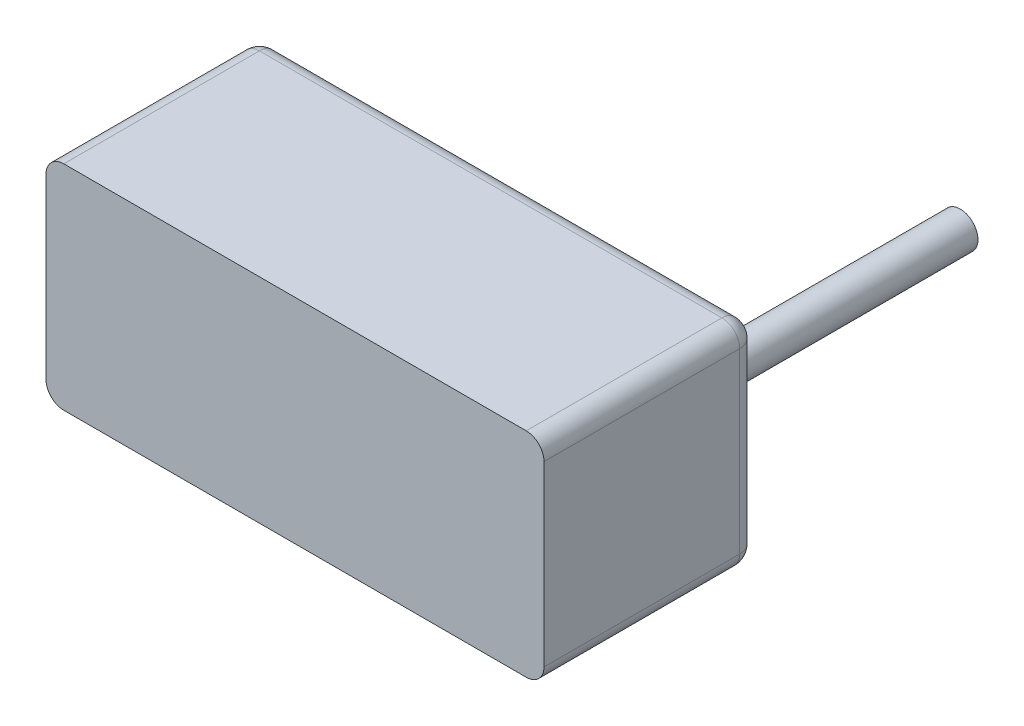
ISO-10303-21;
HEADER;
FILE_DESCRIPTION(('STEP AP214'),'2;1');
FILE_NAME('part.step','',(''),(''),'','','');
FILE_SCHEMA(('AUTOMOTIVE_DESIGN { 1 0 10303 214 1 1 1 1 }'));
ENDSEC;
DATA;
#1=APPLICATION_CONTEXT('core data for automotive mechanical design processes');
#2=APPLICATION_PROTOCOL_DEFINITION('international standard','automotive_design',2000,#1);
#3=PRODUCT_CONTEXT('',#1,'mechanical');
#4=PRODUCT('Part','Part','',(#3));
#5=PRODUCT_RELATED_PRODUCT_CATEGORY('part','',(#4));
#6=PRODUCT_DEFINITION_FORMATION('','',#4);
#7=PRODUCT_DEFINITION_CONTEXT('part definition',#1,'design');
#8=PRODUCT_DEFINITION('design','',#6,#7);
#9=PRODUCT_DEFINITION_SHAPE('','',#8);
#10=(LENGTH_UNIT() NAMED_UNIT(*) SI_UNIT(.MILLI.,.METRE.));
#11=(NAMED_UNIT(*) PLANE_ANGLE_UNIT() SI_UNIT($,.RADIAN.));
#12=(NAMED_UNIT(*) SI_UNIT($,.STERADIAN.) SOLID_ANGLE_UNIT());
#13=UNCERTAINTY_MEASURE_WITH_UNIT(LENGTH_MEASURE(1.E-05),#10,'distance_accuracy_value','');
#14=(GEOMETRIC_REPRESENTATION_CONTEXT(3) GLOBAL_UNCERTAINTY_ASSIGNED_CONTEXT((#13)) GLOBAL_UNIT_ASSIGNED_CONTEXT((#10,
#11,#12)) REPRESENTATION_CONTEXT('',''));
#15=CARTESIAN_POINT('',(0.,0.,0.));
#16=DIRECTION('',(0.,0.,1.));
#17=DIRECTION('',(1.,0.,0.));
#18=AXIS2_PLACEMENT_3D('',#15,#16,#17);
#19=CARTESIAN_POINT('',(-88.9,76.2,38.1));
#20=DIRECTION('',(1.,0.,0.));
#21=DIRECTION('',(0.,0.,-1.));
#22=AXIS2_PLACEMENT_3D('',#19,#20,#21);
#23=PLANE('',#22);
#24=DIRECTION('',(0.,0.,1.));
#25=VECTOR('',#24,1.);
#26=CARTESIAN_POINT('',(-88.9,69.85,-38.1));
#27=LINE('',#26,#25);
#28=CARTESIAN_POINT('',(-88.9,69.85,38.1));
#29=VERTEX_POINT('',#28);
#30=CARTESIAN_POINT('',(-88.9,69.85,-31.75));
#31=VERTEX_POINT('',#30);
#32=EDGE_CURVE('E132',#29,#31,#27,.F.);
#33=ORIENTED_EDGE('',*,*,#32,.T.);
#34=DIRECTION('',(0.,-1.,0.));
#35=VECTOR('',#34,1.);
#36=CARTESIAN_POINT('',(-88.9,76.2,-31.75));
#37=LINE('',#36,#35);
#38=CARTESIAN_POINT('',(-88.9,6.34999999999999,-31.75));
#39=VERTEX_POINT('',#38);
#40=EDGE_CURVE('E207',#31,#39,#37,.T.);
#41=ORIENTED_EDGE('',*,*,#40,.T.);
#42=DIRECTION('',(0.,0.,1.));
#43=VECTOR('',#42,1.);
#44=CARTESIAN_POINT('',(-88.9,6.34999999999999,38.1));
#45=LINE('',#44,#43);
#46=CARTESIAN_POINT('',(-88.9,6.35000000000002,38.1));
#47=VERTEX_POINT('',#46);
#48=EDGE_CURVE('E135',#39,#47,#45,.T.);
#49=ORIENTED_EDGE('',*,*,#48,.T.);
#50=DIRECTION('',(0.,-1.,0.));
#51=VECTOR('',#50,1.);
#52=CARTESIAN_POINT('',(-88.9,76.2,38.1));
#53=LINE('',#52,#51);
#54=EDGE_CURVE('E124',#29,#47,#53,.T.);
#55=ORIENTED_EDGE('',*,*,#54,.F.);
#56=EDGE_LOOP('',(#33,#41,#49,#55));
#57=FACE_BOUND('',#56,.T.);
#58=ADVANCED_FACE('F41',(#57),#23,.F.);
#59=CARTESIAN_POINT('',(88.9,76.2,38.1));
#60=DIRECTION('',(0.,0.,-1.));
#61=DIRECTION('',(-1.,0.,0.));
#62=AXIS2_PLACEMENT_3D('',#59,#60,#61);
#63=PLANE('',#62);
#64=ORIENTED_EDGE('',*,*,#54,.T.);
#65=CARTESIAN_POINT('',(-82.55,6.34999999999999,38.1));
#66=DIRECTION('',(0.,0.,-1.));
#67=DIRECTION('',(-1.,0.,0.));
#68=AXIS2_PLACEMENT_3D('',#65,#66,#67);
#69=CIRCLE('',#68,6.35);
#70=CARTESIAN_POINT('',(-82.55,0.,38.1));
#71=VERTEX_POINT('',#70);
#72=EDGE_CURVE('E151',#47,#71,#69,.F.);
#73=ORIENTED_EDGE('',*,*,#72,.T.);
#74=DIRECTION('',(1.,0.,0.));
#75=VECTOR('',#74,1.);
#76=CARTESIAN_POINT('',(88.9,0.,38.1));
#77=LINE('',#76,#75);
#78=CARTESIAN_POINT('',(82.55,0.,38.1));
#79=VERTEX_POINT('',#78);
#80=EDGE_CURVE('E248',#71,#79,#77,.T.);
#81=ORIENTED_EDGE('',*,*,#80,.T.);
#82=CARTESIAN_POINT('',(82.55,6.34999999999999,38.1));
#83=DIRECTION('',(0.,0.,-1.));
#84=DIRECTION('',(-1.,0.,0.));
#85=AXIS2_PLACEMENT_3D('',#82,#83,#84);
#86=CIRCLE('',#85,6.35);
#87=CARTESIAN_POINT('',(88.9,6.35000000000002,38.1));
#88=VERTEX_POINT('',#87);
#89=EDGE_CURVE('E128',#79,#88,#86,.F.);
#90=ORIENTED_EDGE('',*,*,#89,.T.);
#91=DIRECTION('',(0.,-1.,0.));
#92=VECTOR('',#91,1.);
#93=CARTESIAN_POINT('',(88.9,76.2,38.1));
#94=LINE('',#93,#92);
#95=CARTESIAN_POINT('',(88.9,69.85,38.1));
#96=VERTEX_POINT('',#95);
#97=EDGE_CURVE('E138',#96,#88,#94,.T.);
#98=ORIENTED_EDGE('',*,*,#97,.F.);
#99=CARTESIAN_POINT('',(82.55,69.85,38.1));
#100=DIRECTION('',(0.,0.,-1.));
#101=DIRECTION('',(-1.,0.,0.));
#102=AXIS2_PLACEMENT_3D('',#99,#100,#101);
#103=CIRCLE('',#102,6.35);
#104=CARTESIAN_POINT('',(82.55,76.2,38.1));
#105=VERTEX_POINT('',#104);
#106=EDGE_CURVE('E129',#96,#105,#103,.F.);
#107=ORIENTED_EDGE('',*,*,#106,.T.);
#108=DIRECTION('',(1.,0.,0.));
#109=VECTOR('',#108,1.);
#110=CARTESIAN_POINT('',(88.9,76.2,38.1));
#111=LINE('',#110,#109);
#112=CARTESIAN_POINT('',(-82.55,76.2,38.1));
#113=VERTEX_POINT('',#112);
#114=EDGE_CURVE('E126',#113,#105,#111,.T.);
#115=ORIENTED_EDGE('',*,*,#114,.F.);
#116=CARTESIAN_POINT('',(-82.55,69.85,38.1));
#117=DIRECTION('',(0.,0.,-1.));
#118=DIRECTION('',(-1.,0.,0.));
#119=AXIS2_PLACEMENT_3D('',#116,#117,#118);
#120=CIRCLE('',#119,6.35);
#121=EDGE_CURVE('E121',#113,#29,#120,.F.);
#122=ORIENTED_EDGE('',*,*,#121,.T.);
#123=EDGE_LOOP('',(#64,#73,#81,#90,#98,#107,#115,#122));
#124=FACE_BOUND('',#123,.T.);
#125=ADVANCED_FACE('F123',(#124),#63,.F.);
#126=CARTESIAN_POINT('',(88.9,76.2,38.1));
#127=DIRECTION('',(-1.,0.,0.));
#128=DIRECTION('',(0.,0.,1.));
#129=AXIS2_PLACEMENT_3D('',#126,#127,#128);
#130=PLANE('',#129);
#131=DIRECTION('',(0.,0.,-1.));
#132=VECTOR('',#131,1.);
#133=CARTESIAN_POINT('',(88.9,6.34999999999999,38.1));
#134=LINE('',#133,#132);
#135=CARTESIAN_POINT('',(88.9,6.34999999999999,-31.75));
#136=VERTEX_POINT('',#135);
#137=EDGE_CURVE('E164',#88,#136,#134,.T.);
#138=ORIENTED_EDGE('',*,*,#137,.T.);
#139=DIRECTION('',(0.,-1.,0.));
#140=VECTOR('',#139,1.);
#141=CARTESIAN_POINT('',(88.9,76.2,-31.75));
#142=LINE('',#141,#140);
#143=CARTESIAN_POINT('',(88.9,69.85,-31.75));
#144=VERTEX_POINT('',#143);
#145=EDGE_CURVE('E195',#136,#144,#142,.F.);
#146=ORIENTED_EDGE('',*,*,#145,.T.);
#147=DIRECTION('',(0.,0.,-1.));
#148=VECTOR('',#147,1.);
#149=CARTESIAN_POINT('',(88.9,69.85,38.1));
#150=LINE('',#149,#148);
#151=EDGE_CURVE('E161',#144,#96,#150,.F.);
#152=ORIENTED_EDGE('',*,*,#151,.T.);
#153=ORIENTED_EDGE('',*,*,#97,.T.);
#154=EDGE_LOOP('',(#138,#146,#152,#153));
#155=FACE_BOUND('',#154,.T.);
#156=ADVANCED_FACE('F262',(#155),#130,.F.);
#157=CARTESIAN_POINT('',(88.9,76.2,-38.1));
#158=DIRECTION('',(0.,0.,1.));
#159=DIRECTION('',(1.,0.,0.));
#160=AXIS2_PLACEMENT_3D('',#157,#158,#159);
#161=PLANE('',#160);
#162=DIRECTION('',(-1.,0.,0.));
#163=VECTOR('',#162,1.);
#164=CARTESIAN_POINT('',(82.55,69.85,-38.1));
#165=LINE('',#164,#163);
#166=CARTESIAN_POINT('',(-82.55,69.85,-38.1));
#167=VERTEX_POINT('',#166);
#168=CARTESIAN_POINT('',(82.55,69.85,-38.1));
#169=VERTEX_POINT('',#168);
#170=EDGE_CURVE('E182',#167,#169,#165,.F.);
#171=ORIENTED_EDGE('',*,*,#170,.T.);
#172=DIRECTION('',(0.,-1.,0.));
#173=VECTOR('',#172,1.);
#174=CARTESIAN_POINT('',(82.55,76.2,-38.1));
#175=LINE('',#174,#173);
#176=CARTESIAN_POINT('',(82.55,6.34999999999999,-38.1));
#177=VERTEX_POINT('',#176);
#178=EDGE_CURVE('E191',#169,#177,#175,.T.);
#179=ORIENTED_EDGE('',*,*,#178,.T.);
#180=DIRECTION('',(-1.,0.,0.));
#181=VECTOR('',#180,1.);
#182=CARTESIAN_POINT('',(88.9,6.34999999999999,-38.1));
#183=LINE('',#182,#181);
#184=CARTESIAN_POINT('',(-82.55,6.34999999999999,-38.1));
#185=VERTEX_POINT('',#184);
#186=EDGE_CURVE('E188',#177,#185,#183,.T.);
#187=ORIENTED_EDGE('',*,*,#186,.T.);
#188=DIRECTION('',(0.,-1.,0.));
#189=VECTOR('',#188,1.);
#190=CARTESIAN_POINT('',(-82.55,76.2,-38.1));
#191=LINE('',#190,#189);
#192=EDGE_CURVE('E185',#185,#167,#191,.F.);
#193=ORIENTED_EDGE('',*,*,#192,.T.);
#194=EDGE_LOOP('',(#171,#179,#187,#193));
#195=FACE_BOUND('',#194,.T.);
#196=CARTESIAN_POINT('',(59.69,38.1,-38.1));
#197=DIRECTION('',(0.,0.,1.));
#198=DIRECTION('',(1.,0.,0.));
#199=AXIS2_PLACEMENT_3D('',#196,#197,#198);
#200=CIRCLE('',#199,6.35);
#201=CARTESIAN_POINT('',(66.04,38.1,-38.1));
#202=VERTEX_POINT('',#201);
#203=EDGE_CURVE('E174',#202,#202,#200,.F.);
#204=ORIENTED_EDGE('',*,*,#203,.F.);
#205=EDGE_LOOP('',(#204));
#206=FACE_BOUND('',#205,.T.);
#207=ADVANCED_FACE('F311',(#195,#206),#161,.F.);
#208=CARTESIAN_POINT('',(0.,76.2,0.));
#209=DIRECTION('',(0.,1.,0.));
#210=DIRECTION('',(0.,0.,1.));
#211=AXIS2_PLACEMENT_3D('',#208,#209,#210);
#212=PLANE('',#211);
#213=DIRECTION('',(0.,0.,-1.));
#214=VECTOR('',#213,1.);
#215=CARTESIAN_POINT('',(82.55,76.2,-38.1));
#216=LINE('',#215,#214);
#217=CARTESIAN_POINT('',(82.55,76.2,-31.75));
#218=VERTEX_POINT('',#217);
#219=EDGE_CURVE('E168',#105,#218,#216,.T.);
#220=ORIENTED_EDGE('',*,*,#219,.T.);
#221=DIRECTION('',(-1.,0.,0.));
#222=VECTOR('',#221,1.);
#223=CARTESIAN_POINT('',(-82.55,76.2,-31.75));
#224=LINE('',#223,#222);
#225=CARTESIAN_POINT('',(-82.55,76.2,-31.75));
#226=VERTEX_POINT('',#225);
#227=EDGE_CURVE('E11',#218,#226,#224,.T.);
#228=ORIENTED_EDGE('',*,*,#227,.T.);
#229=DIRECTION('',(0.,0.,1.));
#230=VECTOR('',#229,1.);
#231=CARTESIAN_POINT('',(-82.55,76.2,38.1));
#232=LINE('',#231,#230);
#233=EDGE_CURVE('E171',#226,#113,#232,.T.);
#234=ORIENTED_EDGE('',*,*,#233,.T.);
#235=ORIENTED_EDGE('',*,*,#114,.T.);
#236=EDGE_LOOP('',(#220,#228,#234,#235));
#237=FACE_BOUND('',#236,.T.);
#238=ADVANCED_FACE('F304',(#237),#212,.T.);
#239=CARTESIAN_POINT('',(0.,0.,0.));
#240=DIRECTION('',(0.,1.,0.));
#241=DIRECTION('',(0.,0.,1.));
#242=AXIS2_PLACEMENT_3D('',#239,#240,#241);
#243=PLANE('',#242);
#244=DIRECTION('',(0.,0.,1.));
#245=VECTOR('',#244,1.);
#246=CARTESIAN_POINT('',(-82.55,0.,0.));
#247=LINE('',#246,#245);
#248=CARTESIAN_POINT('',(-82.55,0.,-31.75));
#249=VERTEX_POINT('',#248);
#250=EDGE_CURVE('E157',#71,#249,#247,.F.);
#251=ORIENTED_EDGE('',*,*,#250,.T.);
#252=DIRECTION('',(-1.,0.,0.));
#253=VECTOR('',#252,1.);
#254=CARTESIAN_POINT('',(0.,0.,-31.75));
#255=LINE('',#254,#253);
#256=CARTESIAN_POINT('',(82.55,0.,-31.75));
#257=VERTEX_POINT('',#256);
#258=EDGE_CURVE('E201',#249,#257,#255,.F.);
#259=ORIENTED_EDGE('',*,*,#258,.T.);
#260=DIRECTION('',(0.,0.,-1.));
#261=VECTOR('',#260,1.);
#262=CARTESIAN_POINT('',(82.55,0.,0.));
#263=LINE('',#262,#261);
#264=EDGE_CURVE('E154',#257,#79,#263,.F.);
#265=ORIENTED_EDGE('',*,*,#264,.T.);
#266=ORIENTED_EDGE('',*,*,#80,.F.);
#267=EDGE_LOOP('',(#251,#259,#265,#266));
#268=FACE_BOUND('',#267,.T.);
#269=ADVANCED_FACE('F301',(#268),#243,.F.);
#270=CARTESIAN_POINT('',(-82.55,6.34999999999999,38.1));
#271=DIRECTION('',(0.,0.,1.));
#272=DIRECTION('',(1.,0.,0.));
#273=AXIS2_PLACEMENT_3D('',#270,#271,#272);
#274=CYLINDRICAL_SURFACE('',#273,6.35);
#275=ORIENTED_EDGE('',*,*,#48,.F.);
#276=CARTESIAN_POINT('',(-82.55,6.34999999999999,-31.75));
#277=DIRECTION('',(0.,0.,1.));
#278=DIRECTION('',(1.,0.,0.));
#279=AXIS2_PLACEMENT_3D('',#276,#277,#278);
#280=CIRCLE('',#279,6.35);
#281=EDGE_CURVE('E204',#39,#249,#280,.T.);
#282=ORIENTED_EDGE('',*,*,#281,.T.);
#283=ORIENTED_EDGE('',*,*,#250,.F.);
#284=ORIENTED_EDGE('',*,*,#72,.F.);
#285=EDGE_LOOP('',(#275,#282,#283,#284));
#286=FACE_BOUND('',#285,.T.);
#287=ADVANCED_FACE('F296',(#286),#274,.T.);
#288=CARTESIAN_POINT('',(82.55,6.34999999999999,38.1));
#289=DIRECTION('',(0.,0.,-1.));
#290=DIRECTION('',(-1.,0.,0.));
#291=AXIS2_PLACEMENT_3D('',#288,#289,#290);
#292=CYLINDRICAL_SURFACE('',#291,6.35);
#293=ORIENTED_EDGE('',*,*,#264,.F.);
#294=CARTESIAN_POINT('',(82.55,6.34999999999999,-31.75));
#295=DIRECTION('',(0.,0.,-1.));
#296=DIRECTION('',(-1.,0.,0.));
#297=AXIS2_PLACEMENT_3D('',#294,#295,#296);
#298=CIRCLE('',#297,6.35);
#299=EDGE_CURVE('E198',#257,#136,#298,.F.);
#300=ORIENTED_EDGE('',*,*,#299,.T.);
#301=ORIENTED_EDGE('',*,*,#137,.F.);
#302=ORIENTED_EDGE('',*,*,#89,.F.);
#303=EDGE_LOOP('',(#293,#300,#301,#302));
#304=FACE_BOUND('',#303,.T.);
#305=ADVANCED_FACE('F269',(#304),#292,.T.);
#306=CARTESIAN_POINT('',(-82.55,69.85,0.));
#307=DIRECTION('',(0.,0.,-1.));
#308=DIRECTION('',(-1.,0.,0.));
#309=AXIS2_PLACEMENT_3D('',#306,#307,#308);
#310=CYLINDRICAL_SURFACE('',#309,6.35);
#311=ORIENTED_EDGE('',*,*,#233,.F.);
#312=CARTESIAN_POINT('',(-82.55,69.85,-31.75));
#313=DIRECTION('',(0.,0.,-1.));
#314=DIRECTION('',(-1.,0.,0.));
#315=AXIS2_PLACEMENT_3D('',#312,#313,#314);
#316=CIRCLE('',#315,6.35);
#317=EDGE_CURVE('E51',#226,#31,#316,.F.);
#318=ORIENTED_EDGE('',*,*,#317,.T.);
#319=ORIENTED_EDGE('',*,*,#32,.F.);
#320=ORIENTED_EDGE('',*,*,#121,.F.);
#321=EDGE_LOOP('',(#311,#318,#319,#320));
#322=FACE_BOUND('',#321,.T.);
#323=ADVANCED_FACE('F140',(#322),#310,.T.);
#324=CARTESIAN_POINT('',(82.55,69.85,0.));
#325=DIRECTION('',(0.,0.,1.));
#326=DIRECTION('',(1.,0.,0.));
#327=AXIS2_PLACEMENT_3D('',#324,#325,#326);
#328=CYLINDRICAL_SURFACE('',#327,6.35);
#329=ORIENTED_EDGE('',*,*,#151,.F.);
#330=CARTESIAN_POINT('',(82.55,69.85,-31.75));
#331=DIRECTION('',(0.,0.,1.));
#332=DIRECTION('',(1.,0.,0.));
#333=AXIS2_PLACEMENT_3D('',#330,#331,#332);
#334=CIRCLE('',#333,6.35);
#335=EDGE_CURVE('E178',#144,#218,#334,.T.);
#336=ORIENTED_EDGE('',*,*,#335,.T.);
#337=ORIENTED_EDGE('',*,*,#219,.F.);
#338=ORIENTED_EDGE('',*,*,#106,.F.);
#339=EDGE_LOOP('',(#329,#336,#337,#338));
#340=FACE_BOUND('',#339,.T.);
#341=ADVANCED_FACE('F281',(#340),#328,.T.);
#342=CARTESIAN_POINT('',(59.69,38.1,-139.7));
#343=DIRECTION('',(0.,0.,1.));
#344=DIRECTION('',(1.,0.,0.));
#345=AXIS2_PLACEMENT_3D('',#342,#343,#344);
#346=CYLINDRICAL_SURFACE('',#345,6.35);
#347=CARTESIAN_POINT('',(59.69,38.1,-139.7));
#348=DIRECTION('',(0.,0.,-1.));
#349=DIRECTION('',(-1.,0.,0.));
#350=AXIS2_PLACEMENT_3D('',#347,#348,#349);
#351=CIRCLE('',#350,6.35);
#352=CARTESIAN_POINT('',(53.34,38.1,-139.7));
#353=VERTEX_POINT('',#352);
#354=EDGE_CURVE('E243',#353,#353,#351,.T.);
#355=ORIENTED_EDGE('',*,*,#354,.F.);
#356=EDGE_LOOP('',(#355));
#357=FACE_BOUND('',#356,.T.);
#358=ORIENTED_EDGE('',*,*,#203,.T.);
#359=EDGE_LOOP('',(#358));
#360=FACE_BOUND('',#359,.T.);
#361=ADVANCED_FACE('F328',(#357,#360),#346,.T.);
#362=CARTESIAN_POINT('',(59.69,38.1,-139.7));
#363=DIRECTION('',(0.,0.,-1.));
#364=DIRECTION('',(-1.,0.,0.));
#365=AXIS2_PLACEMENT_3D('',#362,#363,#364);
#366=PLANE('',#365);
#367=ORIENTED_EDGE('',*,*,#354,.T.);
#368=EDGE_LOOP('',(#367));
#369=FACE_BOUND('',#368,.T.);
#370=ADVANCED_FACE('F344',(#369),#366,.T.);
#371=CARTESIAN_POINT('',(-82.55,6.34999999999999,-31.75));
#372=DIRECTION('',(0.,0.,1.));
#373=DIRECTION('',(1.,0.,0.));
#374=AXIS2_PLACEMENT_3D('',#371,#372,#373);
#375=SPHERICAL_SURFACE('',#374,6.35);
#376=CARTESIAN_POINT('',(-82.55,6.34999999999999,-31.75));
#377=DIRECTION('',(1.,0.,0.));
#378=DIRECTION('',(0.,0.,-1.));
#379=AXIS2_PLACEMENT_3D('',#376,#377,#378);
#380=CIRCLE('',#379,6.35);
#381=EDGE_CURVE('E233',#249,#185,#380,.T.);
#382=ORIENTED_EDGE('',*,*,#381,.F.);
#383=ORIENTED_EDGE('',*,*,#281,.F.);
#384=CARTESIAN_POINT('',(-82.55,6.34999999999999,-31.75));
#385=DIRECTION('',(0.,1.,0.));
#386=DIRECTION('',(0.,0.,1.));
#387=AXIS2_PLACEMENT_3D('',#384,#385,#386);
#388=CIRCLE('',#387,6.35);
#389=EDGE_CURVE('E45',#185,#39,#388,.T.);
#390=ORIENTED_EDGE('',*,*,#389,.F.);
#391=EDGE_LOOP('',(#382,#383,#390));
#392=FACE_BOUND('',#391,.T.);
#393=ADVANCED_FACE('F43',(#392),#375,.T.);
#394=CARTESIAN_POINT('',(-82.55,76.2,-31.75));
#395=DIRECTION('',(0.,-1.,0.));
#396=DIRECTION('',(0.,0.,-1.));
#397=AXIS2_PLACEMENT_3D('',#394,#395,#396);
#398=CYLINDRICAL_SURFACE('',#397,6.35);
#399=ORIENTED_EDGE('',*,*,#389,.T.);
#400=ORIENTED_EDGE('',*,*,#40,.F.);
#401=CARTESIAN_POINT('',(-82.55,69.85,-31.75));
#402=DIRECTION('',(0.,1.,0.));
#403=DIRECTION('',(0.,0.,1.));
#404=AXIS2_PLACEMENT_3D('',#401,#402,#403);
#405=CIRCLE('',#404,6.35);
#406=EDGE_CURVE('E230',#167,#31,#405,.T.);
#407=ORIENTED_EDGE('',*,*,#406,.F.);
#408=ORIENTED_EDGE('',*,*,#192,.F.);
#409=EDGE_LOOP('',(#399,#400,#407,#408));
#410=FACE_BOUND('',#409,.T.);
#411=ADVANCED_FACE('F293',(#410),#398,.T.);
#412=CARTESIAN_POINT('',(88.9,6.34999999999999,-31.75));
#413=DIRECTION('',(-1.,0.,0.));
#414=DIRECTION('',(0.,0.,1.));
#415=AXIS2_PLACEMENT_3D('',#412,#413,#414);
#416=CYLINDRICAL_SURFACE('',#415,6.35);
#417=ORIENTED_EDGE('',*,*,#381,.T.);
#418=ORIENTED_EDGE('',*,*,#186,.F.);
#419=CARTESIAN_POINT('',(82.55,6.35,-31.75));
#420=DIRECTION('',(1.,0.,0.));
#421=DIRECTION('',(0.,0.,-1.));
#422=AXIS2_PLACEMENT_3D('',#419,#420,#421);
#423=CIRCLE('',#422,6.35);
#424=EDGE_CURVE('E226',#257,#177,#423,.T.);
#425=ORIENTED_EDGE('',*,*,#424,.F.);
#426=ORIENTED_EDGE('',*,*,#258,.F.);
#427=EDGE_LOOP('',(#417,#418,#425,#426));
#428=FACE_BOUND('',#427,.T.);
#429=ADVANCED_FACE('F299',(#428),#416,.T.);
#430=CARTESIAN_POINT('',(-82.55,69.85,-31.75));
#431=DIRECTION('',(0.,0.,1.));
#432=DIRECTION('',(1.,0.,0.));
#433=AXIS2_PLACEMENT_3D('',#430,#431,#432);
#434=SPHERICAL_SURFACE('',#433,6.35);
#435=ORIENTED_EDGE('',*,*,#406,.T.);
#436=ORIENTED_EDGE('',*,*,#317,.F.);
#437=CARTESIAN_POINT('',(-82.55,69.85,-31.75));
#438=DIRECTION('',(1.,0.,0.));
#439=DIRECTION('',(0.,0.,-1.));
#440=AXIS2_PLACEMENT_3D('',#437,#438,#439);
#441=CIRCLE('',#440,6.35);
#442=EDGE_CURVE('E222',#167,#226,#441,.T.);
#443=ORIENTED_EDGE('',*,*,#442,.F.);
#444=EDGE_LOOP('',(#435,#436,#443));
#445=FACE_BOUND('',#444,.T.);
#446=ADVANCED_FACE('F291',(#445),#434,.T.);
#447=CARTESIAN_POINT('',(82.55,6.34999999999999,-31.75));
#448=DIRECTION('',(0.,0.,1.));
#449=DIRECTION('',(1.,0.,0.));
#450=AXIS2_PLACEMENT_3D('',#447,#448,#449);
#451=SPHERICAL_SURFACE('',#450,6.35);
#452=ORIENTED_EDGE('',*,*,#299,.F.);
#453=ORIENTED_EDGE('',*,*,#424,.T.);
#454=CARTESIAN_POINT('',(82.55,6.34999999999999,-31.75));
#455=DIRECTION('',(0.,1.,0.));
#456=DIRECTION('',(0.,0.,1.));
#457=AXIS2_PLACEMENT_3D('',#454,#455,#456);
#458=CIRCLE('',#457,6.35);
#459=EDGE_CURVE('E219',#136,#177,#458,.T.);
#460=ORIENTED_EDGE('',*,*,#459,.F.);
#461=EDGE_LOOP('',(#452,#453,#460));
#462=FACE_BOUND('',#461,.T.);
#463=ADVANCED_FACE('F273',(#462),#451,.T.);
#464=CARTESIAN_POINT('',(0.,69.85,-31.75));
#465=DIRECTION('',(1.,0.,0.));
#466=DIRECTION('',(0.,0.,-1.));
#467=AXIS2_PLACEMENT_3D('',#464,#465,#466);
#468=CYLINDRICAL_SURFACE('',#467,6.35);
#469=ORIENTED_EDGE('',*,*,#442,.T.);
#470=ORIENTED_EDGE('',*,*,#227,.F.);
#471=CARTESIAN_POINT('',(82.55,69.85,-31.75));
#472=DIRECTION('',(1.,0.,0.));
#473=DIRECTION('',(0.,0.,-1.));
#474=AXIS2_PLACEMENT_3D('',#471,#472,#473);
#475=CIRCLE('',#474,6.35);
#476=EDGE_CURVE('E216',#169,#218,#475,.T.);
#477=ORIENTED_EDGE('',*,*,#476,.F.);
#478=ORIENTED_EDGE('',*,*,#170,.F.);
#479=EDGE_LOOP('',(#469,#470,#477,#478));
#480=FACE_BOUND('',#479,.T.);
#481=ADVANCED_FACE('F288',(#480),#468,.T.);
#482=CARTESIAN_POINT('',(82.55,76.2,-31.75));
#483=DIRECTION('',(0.,-1.,0.));
#484=DIRECTION('',(0.,0.,-1.));
#485=AXIS2_PLACEMENT_3D('',#482,#483,#484);
#486=CYLINDRICAL_SURFACE('',#485,6.35);
#487=ORIENTED_EDGE('',*,*,#459,.T.);
#488=ORIENTED_EDGE('',*,*,#178,.F.);
#489=CARTESIAN_POINT('',(82.55,69.85,-31.75));
#490=DIRECTION('',(0.,1.,0.));
#491=DIRECTION('',(0.,0.,1.));
#492=AXIS2_PLACEMENT_3D('',#489,#490,#491);
#493=CIRCLE('',#492,6.35);
#494=EDGE_CURVE('E212',#144,#169,#493,.T.);
#495=ORIENTED_EDGE('',*,*,#494,.F.);
#496=ORIENTED_EDGE('',*,*,#145,.F.);
#497=EDGE_LOOP('',(#487,#488,#495,#496));
#498=FACE_BOUND('',#497,.T.);
#499=ADVANCED_FACE('F278',(#498),#486,.T.);
#500=CARTESIAN_POINT('',(82.55,69.85,-31.75));
#501=DIRECTION('',(0.,0.,1.));
#502=DIRECTION('',(1.,0.,0.));
#503=AXIS2_PLACEMENT_3D('',#500,#501,#502);
#504=SPHERICAL_SURFACE('',#503,6.35);
#505=ORIENTED_EDGE('',*,*,#476,.T.);
#506=ORIENTED_EDGE('',*,*,#335,.F.);
#507=ORIENTED_EDGE('',*,*,#494,.T.);
#508=EDGE_LOOP('',(#505,#506,#507));
#509=FACE_BOUND('',#508,.T.);
#510=ADVANCED_FACE('F284',(#509),#504,.T.);
#511=CLOSED_SHELL('',(#58,#125,#156,#207,#238,#269,#287,#305,#323,#341,#361,#370,#393,#411,#429,
#446,#463,#481,#499,#510));
#512=MANIFOLD_SOLID_BREP('B2',#511);
#513=ADVANCED_BREP_SHAPE_REPRESENTATION('',(#18,#512),#14);
#514=SHAPE_DEFINITION_REPRESENTATION(#9,#513);
ENDSEC;
END-ISO-10303-21;
